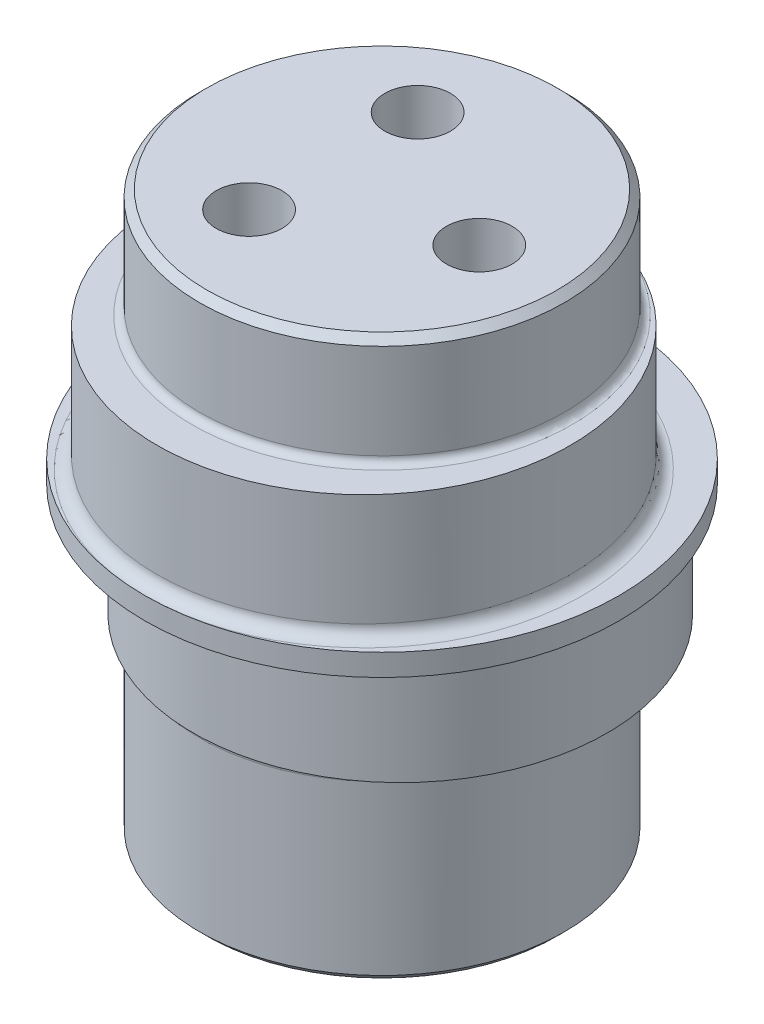
ISO-10303-21;
HEADER;
FILE_DESCRIPTION(('STEP AP214'),'2;1');
FILE_NAME('part.step','',(''),(''),'','','');
FILE_SCHEMA(('AUTOMOTIVE_DESIGN { 1 0 10303 214 1 1 1 1 }'));
ENDSEC;
DATA;
#1=APPLICATION_CONTEXT('core data for automotive mechanical design processes');
#2=APPLICATION_PROTOCOL_DEFINITION('international standard','automotive_design',2000,#1);
#3=PRODUCT_CONTEXT('',#1,'mechanical');
#4=PRODUCT('Part','Part','',(#3));
#5=PRODUCT_RELATED_PRODUCT_CATEGORY('part','',(#4));
#6=PRODUCT_DEFINITION_FORMATION('','',#4);
#7=PRODUCT_DEFINITION_CONTEXT('part definition',#1,'design');
#8=PRODUCT_DEFINITION('design','',#6,#7);
#9=PRODUCT_DEFINITION_SHAPE('','',#8);
#10=(LENGTH_UNIT() NAMED_UNIT(*) SI_UNIT(.MILLI.,.METRE.));
#11=(NAMED_UNIT(*) PLANE_ANGLE_UNIT() SI_UNIT($,.RADIAN.));
#12=(NAMED_UNIT(*) SI_UNIT($,.STERADIAN.) SOLID_ANGLE_UNIT());
#13=UNCERTAINTY_MEASURE_WITH_UNIT(LENGTH_MEASURE(1.E-05),#10,'distance_accuracy_value','');
#14=(GEOMETRIC_REPRESENTATION_CONTEXT(3) GLOBAL_UNCERTAINTY_ASSIGNED_CONTEXT((#13)) GLOBAL_UNIT_ASSIGNED_CONTEXT((#10,
#11,#12)) REPRESENTATION_CONTEXT('',''));
#15=CARTESIAN_POINT('',(0.,0.,0.));
#16=DIRECTION('',(0.,0.,1.));
#17=DIRECTION('',(1.,0.,0.));
#18=AXIS2_PLACEMENT_3D('',#15,#16,#17);
#19=CARTESIAN_POINT('',(-2.,15.5,3.46410161513775));
#20=DIRECTION('',(0.,-1.,0.));
#21=DIRECTION('',(0.,0.,-1.));
#22=AXIS2_PLACEMENT_3D('',#19,#20,#21);
#23=CYLINDRICAL_SURFACE('',#22,1.35);
#24=CARTESIAN_POINT('',(-2.,15.5,3.46410161513775));
#25=DIRECTION('',(0.,-1.,0.));
#26=DIRECTION('',(0.,0.,-1.));
#27=AXIS2_PLACEMENT_3D('',#24,#25,#26);
#28=CIRCLE('',#27,1.35);
#29=CARTESIAN_POINT('',(-2.,15.5,2.11410161513775));
#30=VERTEX_POINT('',#29);
#31=EDGE_CURVE('E251',#30,#30,#28,.T.);
#32=ORIENTED_EDGE('',*,*,#31,.F.);
#33=EDGE_LOOP('',(#32));
#34=FACE_BOUND('',#33,.T.);
#35=CARTESIAN_POINT('',(-2.,-4.5,3.46410161513775));
#36=DIRECTION('',(0.,-1.,0.));
#37=DIRECTION('',(0.,0.,-1.));
#38=AXIS2_PLACEMENT_3D('',#35,#36,#37);
#39=CIRCLE('',#38,1.35);
#40=CARTESIAN_POINT('',(-2.,-4.5,2.11410161513775));
#41=VERTEX_POINT('',#40);
#42=EDGE_CURVE('E255',#41,#41,#39,.F.);
#43=ORIENTED_EDGE('',*,*,#42,.F.);
#44=EDGE_LOOP('',(#43));
#45=FACE_BOUND('',#44,.T.);
#46=ADVANCED_FACE('F38',(#34,#45),#23,.F.);
#47=CARTESIAN_POINT('',(-2.,15.5,-3.46410161513776));
#48=DIRECTION('',(0.,-1.,0.));
#49=DIRECTION('',(0.,0.,-1.));
#50=AXIS2_PLACEMENT_3D('',#47,#48,#49);
#51=CYLINDRICAL_SURFACE('',#50,1.35);
#52=CARTESIAN_POINT('',(-2.,15.5,-3.46410161513776));
#53=DIRECTION('',(0.,-1.,0.));
#54=DIRECTION('',(0.,0.,-1.));
#55=AXIS2_PLACEMENT_3D('',#52,#53,#54);
#56=CIRCLE('',#55,1.35);
#57=CARTESIAN_POINT('',(-2.,15.5,-4.81410161513775));
#58=VERTEX_POINT('',#57);
#59=EDGE_CURVE('E254',#58,#58,#56,.T.);
#60=ORIENTED_EDGE('',*,*,#59,.F.);
#61=EDGE_LOOP('',(#60));
#62=FACE_BOUND('',#61,.T.);
#63=CARTESIAN_POINT('',(-2.,-4.5,-3.46410161513776));
#64=DIRECTION('',(0.,-1.,0.));
#65=DIRECTION('',(0.,0.,-1.));
#66=AXIS2_PLACEMENT_3D('',#63,#64,#65);
#67=CIRCLE('',#66,1.35);
#68=CARTESIAN_POINT('',(-2.,-4.5,-4.81410161513775));
#69=VERTEX_POINT('',#68);
#70=EDGE_CURVE('E309',#69,#69,#67,.F.);
#71=ORIENTED_EDGE('',*,*,#70,.F.);
#72=EDGE_LOOP('',(#71));
#73=FACE_BOUND('',#72,.T.);
#74=ADVANCED_FACE('F198',(#62,#73),#51,.F.);
#75=CARTESIAN_POINT('',(4.,15.5,0.));
#76=DIRECTION('',(0.,-1.,0.));
#77=DIRECTION('',(0.,0.,-1.));
#78=AXIS2_PLACEMENT_3D('',#75,#76,#77);
#79=CYLINDRICAL_SURFACE('',#78,1.35);
#80=CARTESIAN_POINT('',(4.,15.5,0.));
#81=DIRECTION('',(0.,-1.,0.));
#82=DIRECTION('',(0.,0.,-1.));
#83=AXIS2_PLACEMENT_3D('',#80,#81,#82);
#84=CIRCLE('',#83,1.35);
#85=CARTESIAN_POINT('',(4.,15.5,-1.35));
#86=VERTEX_POINT('',#85);
#87=EDGE_CURVE('E258',#86,#86,#84,.T.);
#88=ORIENTED_EDGE('',*,*,#87,.F.);
#89=EDGE_LOOP('',(#88));
#90=FACE_BOUND('',#89,.T.);
#91=CARTESIAN_POINT('',(4.,-4.5,0.));
#92=DIRECTION('',(0.,-1.,0.));
#93=DIRECTION('',(0.,0.,-1.));
#94=AXIS2_PLACEMENT_3D('',#91,#92,#93);
#95=CIRCLE('',#94,1.35);
#96=CARTESIAN_POINT('',(4.,-4.5,-1.35));
#97=VERTEX_POINT('',#96);
#98=EDGE_CURVE('E264',#97,#97,#95,.F.);
#99=ORIENTED_EDGE('',*,*,#98,.F.);
#100=EDGE_LOOP('',(#99));
#101=FACE_BOUND('',#100,.T.);
#102=ADVANCED_FACE('F204',(#90,#101),#79,.F.);
#103=CARTESIAN_POINT('',(0.,5.,-0.75));
#104=DIRECTION('',(0.,-1.,0.));
#105=DIRECTION('',(0.,0.,-1.));
#106=AXIS2_PLACEMENT_3D('',#103,#104,#105);
#107=CYLINDRICAL_SURFACE('',#106,8.5);
#108=CARTESIAN_POINT('',(0.,4.5,-0.75));
#109=DIRECTION('',(0.,1.,0.));
#110=DIRECTION('',(0.,0.,1.));
#111=AXIS2_PLACEMENT_3D('',#108,#109,#110);
#112=CIRCLE('',#111,8.5);
#113=CARTESIAN_POINT('',(0.,4.5,7.75));
#114=VERTEX_POINT('',#113);
#115=EDGE_CURVE('E314',#114,#114,#112,.F.);
#116=ORIENTED_EDGE('',*,*,#115,.T.);
#117=EDGE_LOOP('',(#116));
#118=FACE_BOUND('',#117,.T.);
#119=CARTESIAN_POINT('',(0.,0.,-0.75));
#120=DIRECTION('',(0.,1.,0.));
#121=DIRECTION('',(0.,0.,1.));
#122=AXIS2_PLACEMENT_3D('',#119,#120,#121);
#123=CIRCLE('',#122,8.5);
#124=CARTESIAN_POINT('',(2.92284060841881,0.,7.23166666666668));
#125=VERTEX_POINT('',#124);
#126=CARTESIAN_POINT('',(-2.92284060841881,0.,7.23166666666668));
#127=VERTEX_POINT('',#126);
#128=EDGE_CURVE('E235',#125,#127,#123,.T.);
#129=ORIENTED_EDGE('',*,*,#128,.T.);
#130=EDGE_CURVE('E91',#127,#125,#123,.T.);
#131=ORIENTED_EDGE('',*,*,#130,.T.);
#132=EDGE_LOOP('',(#129,#131));
#133=FACE_BOUND('',#132,.T.);
#134=ADVANCED_FACE('F297',(#118,#133),#107,.T.);
#135=CARTESIAN_POINT('',(0.,0.,-0.75));
#136=DIRECTION('',(0.,1.,0.));
#137=DIRECTION('',(0.,0.,1.));
#138=AXIS2_PLACEMENT_3D('',#135,#136,#137);
#139=PLANE('',#138);
#140=ORIENTED_EDGE('',*,*,#128,.F.);
#141=CARTESIAN_POINT('',(0.,0.,0.));
#142=DIRECTION('',(0.,1.,0.));
#143=DIRECTION('',(0.,0.,1.));
#144=AXIS2_PLACEMENT_3D('',#141,#142,#143);
#145=CIRCLE('',#144,7.8);
#146=EDGE_CURVE('E105',#125,#127,#145,.T.);
#147=ORIENTED_EDGE('',*,*,#146,.T.);
#148=EDGE_LOOP('',(#140,#147));
#149=FACE_BOUND('',#148,.T.);
#150=ADVANCED_FACE('F302',(#149),#139,.F.);
#151=CARTESIAN_POINT('',(0.,5.,0.75));
#152=DIRECTION('',(0.,1.,0.));
#153=DIRECTION('',(0.,0.,1.));
#154=AXIS2_PLACEMENT_3D('',#151,#152,#153);
#155=PLANE('',#154);
#156=CARTESIAN_POINT('',(0.,5.,0.));
#157=DIRECTION('',(0.,1.,0.));
#158=DIRECTION('',(0.,0.,1.));
#159=AXIS2_PLACEMENT_3D('',#156,#157,#158);
#160=CIRCLE('',#159,9.75);
#161=CARTESIAN_POINT('',(0.,5.,-9.75));
#162=VERTEX_POINT('',#161);
#163=EDGE_CURVE('E245',#162,#162,#160,.T.);
#164=ORIENTED_EDGE('',*,*,#163,.F.);
#165=CARTESIAN_POINT('',(0.,5.,-0.75));
#166=DIRECTION('',(0.,1.,0.));
#167=DIRECTION('',(0.,0.,1.));
#168=AXIS2_PLACEMENT_3D('',#165,#166,#167);
#169=CIRCLE('',#168,9.);
#170=EDGE_CURVE('E52',#162,#162,#169,.T.);
#171=ORIENTED_EDGE('',*,*,#170,.T.);
#172=EDGE_LOOP('',(#164,#171));
#173=FACE_BOUND('',#172,.T.);
#174=ADVANCED_FACE('F345',(#173),#155,.F.);
#175=CARTESIAN_POINT('',(0.,5.9,0.));
#176=DIRECTION('',(0.,-1.,0.));
#177=DIRECTION('',(0.,0.,-1.));
#178=AXIS2_PLACEMENT_3D('',#175,#176,#177);
#179=CYLINDRICAL_SURFACE('',#178,9.75);
#180=CARTESIAN_POINT('',(0.,5.9,0.));
#181=DIRECTION('',(0.,1.,0.));
#182=DIRECTION('',(0.,0.,1.));
#183=AXIS2_PLACEMENT_3D('',#180,#181,#182);
#184=CIRCLE('',#183,9.75);
#185=CARTESIAN_POINT('',(0.,5.9,9.75));
#186=VERTEX_POINT('',#185);
#187=EDGE_CURVE('E248',#186,#186,#184,.T.);
#188=ORIENTED_EDGE('',*,*,#187,.F.);
#189=EDGE_LOOP('',(#188));
#190=FACE_BOUND('',#189,.T.);
#191=ORIENTED_EDGE('',*,*,#163,.T.);
#192=EDGE_LOOP('',(#191));
#193=FACE_BOUND('',#192,.T.);
#194=ADVANCED_FACE('F349',(#190,#193),#179,.T.);
#195=CARTESIAN_POINT('',(0.,5.9,0.));
#196=DIRECTION('',(0.,1.,0.));
#197=DIRECTION('',(0.,0.,1.));
#198=AXIS2_PLACEMENT_3D('',#195,#196,#197);
#199=PLANE('',#198);
#200=ORIENTED_EDGE('',*,*,#187,.T.);
#201=CARTESIAN_POINT('',(0.,5.9,0.75));
#202=DIRECTION('',(0.,1.,0.));
#203=DIRECTION('',(0.,0.,1.));
#204=AXIS2_PLACEMENT_3D('',#201,#202,#203);
#205=CIRCLE('',#204,9.);
#206=EDGE_CURVE('E57',#186,#186,#205,.F.);
#207=ORIENTED_EDGE('',*,*,#206,.T.);
#208=EDGE_LOOP('',(#200,#207));
#209=FACE_BOUND('',#208,.T.);
#210=ADVANCED_FACE('F360',(#209),#199,.T.);
#211=CARTESIAN_POINT('',(0.,11.,0.75));
#212=DIRECTION('',(0.,1.,0.));
#213=DIRECTION('',(0.,0.,1.));
#214=AXIS2_PLACEMENT_3D('',#211,#212,#213);
#215=PLANE('',#214);
#216=CARTESIAN_POINT('',(0.,11.,0.75));
#217=DIRECTION('',(0.,1.,0.));
#218=DIRECTION('',(0.,0.,1.));
#219=AXIS2_PLACEMENT_3D('',#216,#217,#218);
#220=CIRCLE('',#219,8.5);
#221=CARTESIAN_POINT('',(-2.92284060841881,11.,-7.23166666666668));
#222=VERTEX_POINT('',#221);
#223=CARTESIAN_POINT('',(2.92284060841881,11.,-7.23166666666668));
#224=VERTEX_POINT('',#223);
#225=EDGE_CURVE('E244',#222,#224,#220,.T.);
#226=ORIENTED_EDGE('',*,*,#225,.T.);
#227=CARTESIAN_POINT('',(0.,11.,0.));
#228=DIRECTION('',(0.,1.,0.));
#229=DIRECTION('',(0.,0.,1.));
#230=AXIS2_PLACEMENT_3D('',#227,#228,#229);
#231=CIRCLE('',#230,7.8);
#232=EDGE_CURVE('E326',#224,#222,#231,.F.);
#233=ORIENTED_EDGE('',*,*,#232,.T.);
#234=EDGE_LOOP('',(#226,#233));
#235=FACE_BOUND('',#234,.T.);
#236=ADVANCED_FACE('F356',(#235),#215,.T.);
#237=CARTESIAN_POINT('',(0.,11.,0.75));
#238=DIRECTION('',(0.,-1.,0.));
#239=DIRECTION('',(0.,0.,-1.));
#240=AXIS2_PLACEMENT_3D('',#237,#238,#239);
#241=CYLINDRICAL_SURFACE('',#240,8.5);
#242=CARTESIAN_POINT('',(0.,6.4,0.75));
#243=DIRECTION('',(0.,1.,0.));
#244=DIRECTION('',(0.,0.,1.));
#245=AXIS2_PLACEMENT_3D('',#242,#243,#244);
#246=CIRCLE('',#245,8.5);
#247=CARTESIAN_POINT('',(0.,6.4,9.25));
#248=VERTEX_POINT('',#247);
#249=EDGE_CURVE('E177',#248,#248,#246,.T.);
#250=ORIENTED_EDGE('',*,*,#249,.T.);
#251=EDGE_LOOP('',(#250));
#252=FACE_BOUND('',#251,.T.);
#253=EDGE_CURVE('E241',#224,#222,#220,.T.);
#254=ORIENTED_EDGE('',*,*,#253,.F.);
#255=ORIENTED_EDGE('',*,*,#225,.F.);
#256=EDGE_LOOP('',(#254,#255));
#257=FACE_BOUND('',#256,.T.);
#258=ADVANCED_FACE('F352',(#252,#257),#241,.T.);
#259=CARTESIAN_POINT('',(0.,15.5,0.));
#260=DIRECTION('',(0.,-1.,0.));
#261=DIRECTION('',(0.,0.,-1.));
#262=AXIS2_PLACEMENT_3D('',#259,#260,#261);
#263=CYLINDRICAL_SURFACE('',#262,7.5);
#264=CARTESIAN_POINT('',(0.,15.2,0.));
#265=DIRECTION('',(0.,1.,0.));
#266=DIRECTION('',(0.,0.,1.));
#267=AXIS2_PLACEMENT_3D('',#264,#265,#266);
#268=CIRCLE('',#267,7.5);
#269=CARTESIAN_POINT('',(0.,15.2,7.5));
#270=VERTEX_POINT('',#269);
#271=EDGE_CURVE('E11',#270,#270,#268,.F.);
#272=ORIENTED_EDGE('',*,*,#271,.T.);
#273=EDGE_LOOP('',(#272));
#274=FACE_BOUND('',#273,.T.);
#275=CARTESIAN_POINT('',(0.,11.3,0.));
#276=DIRECTION('',(0.,1.,0.));
#277=DIRECTION('',(0.,0.,1.));
#278=AXIS2_PLACEMENT_3D('',#275,#276,#277);
#279=CIRCLE('',#278,7.5);
#280=CARTESIAN_POINT('',(-2.81042366194116,11.3,-6.95352564102565));
#281=VERTEX_POINT('',#280);
#282=CARTESIAN_POINT('',(2.81042366194116,11.3,-6.95352564102565));
#283=VERTEX_POINT('',#282);
#284=EDGE_CURVE('E107',#281,#283,#279,.T.);
#285=ORIENTED_EDGE('',*,*,#284,.T.);
#286=CARTESIAN_POINT('',(3.42661707646707,11.29887783112,-6.67145377045096));
#287=CARTESIAN_POINT('',(3.42559649074183,10.9717556479469,-6.67197796751421));
#288=CARTESIAN_POINT('',(3.57458371878677,11.,-6.96183189893196));
#289=CARTESIAN_POINT('',(3.24021780547267,11.299630464701,-6.76721537681055));
#290=CARTESIAN_POINT('',(3.24255553831425,10.9820218091444,-6.76616827196237));
#291=CARTESIAN_POINT('',(3.37641030183633,11.,-7.05369975053847));
#292=CARTESIAN_POINT('',(3.04979498297188,11.2999504551244,-6.85512498255487));
#293=CARTESIAN_POINT('',(3.05191157084359,10.9907873242966,-6.85430330494979));
#294=CARTESIAN_POINT('',(3.17498254013272,11.,-7.13777450821522));
#295=CARTESIAN_POINT('',(2.66227483668071,11.3000398221389,-7.01470769069346));
#296=CARTESIAN_POINT('',(2.6648028741463,11.0055976466942,-7.013617905485));
#297=CARTESIAN_POINT('',(2.76676390811614,11.,-7.29005174489685));
#298=CARTESIAN_POINT('',(2.46517788093677,11.2998092290436,-7.08638168673307));
#299=CARTESIAN_POINT('',(2.46734981088588,11.0117510472977,-7.08566956098198));
#300=CARTESIAN_POINT('',(2.55997333368333,11.,-7.35825509750606));
#301=CARTESIAN_POINT('',(2.06595778532719,11.2991126325111,-7.21287737323461));
#302=CARTESIAN_POINT('',(2.0682791893251,11.0220036222834,-7.21216528851013));
#303=CARTESIAN_POINT('',(2.14246271237897,11.,-7.47842434943333));
#304=CARTESIAN_POINT('',(1.86384254114973,11.2986469790473,-7.26772392289646));
#305=CARTESIAN_POINT('',(1.86571079864528,11.0261690197102,-7.26727678678291));
#306=CARTESIAN_POINT('',(1.93174895449553,11.,-7.530414202855));
#307=CARTESIAN_POINT('',(1.45578931745062,11.2977081427026,-7.36033282851974));
#308=CARTESIAN_POINT('',(1.45764317994122,11.0329042612406,-7.35993494524017));
#309=CARTESIAN_POINT('',(1.5073095395259,11.,-7.61809554048412));
#310=CARTESIAN_POINT('',(1.24985136459923,11.2972349598743,-7.39809530362666));
#311=CARTESIAN_POINT('',(1.25118354438375,11.0355106286144,-7.39792891807439));
#312=CARTESIAN_POINT('',(1.29358390345547,11.,-7.65378713835672));
#313=CARTESIAN_POINT('',(0.625315112082931,11.2960774558286,-7.48573627591765));
#314=CARTESIAN_POINT('',(0.628862132790521,11.0413988305498,-7.48519754716966));
#315=CARTESIAN_POINT('',(0.646353719918522,11.,-7.7365820152759));
#316=CARTESIAN_POINT('',(0.202694055332462,11.2956650911108,-7.50911400888112));
#317=CARTESIAN_POINT('',(0.202110014819041,11.0428416486147,-7.50910449436265));
#318=CARTESIAN_POINT('',(0.209609964426694,11.,-7.75859738309841));
#319=CARTESIAN_POINT('',(-0.640468697414072,11.29604112319,-7.48449640898827));
#320=CARTESIAN_POINT('',(-0.641457731944169,11.041262338408,-7.48445997042964));
#321=CARTESIAN_POINT('',(-0.662248533128678,11.,-7.73537561694435));
#322=CARTESIAN_POINT('',(-1.06101036027408,11.2968295390607,-7.43649994240693));
#323=CARTESIAN_POINT('',(-1.06610026288517,11.0382109693301,-7.43544314782227));
#324=CARTESIAN_POINT('',(-1.09736324920611,11.,-7.69013741469584));
#325=CARTESIAN_POINT('',(-1.68079470704124,11.2982160543476,-7.31228278359564));
#326=CARTESIAN_POINT('',(-1.68254539730568,11.0294524261598,-7.31195052439859));
#327=CARTESIAN_POINT('',(-1.74119902704398,11.,-7.57261627781647));
#328=CARTESIAN_POINT('',(-1.8855719254538,11.2987122694487,-7.26216549234535));
#329=CARTESIAN_POINT('',(-1.88780679683193,11.0257675257551,-7.26153925086682));
#330=CARTESIAN_POINT('',(-1.95435967110387,11.,-7.52515783588596));
#331=CARTESIAN_POINT('',(-2.29023780254366,11.299535690764,-7.14486796754013));
#332=CARTESIAN_POINT('',(-2.2923666506819,11.0165883024139,-7.14422898580564));
#333=CARTESIAN_POINT('',(-2.3768089348923,11.,-7.41384999625708));
#334=CARTESIAN_POINT('',(-2.49012639891203,11.2998628948251,-7.07768751662733));
#335=CARTESIAN_POINT('',(-2.49264966433367,11.0110387010834,-7.07673594835737));
#336=CARTESIAN_POINT('',(-2.58609750526026,11.,-7.3500003897609));
#337=CARTESIAN_POINT('',(-2.88382677663446,11.3000707626314,-6.92661994082238));
#338=CARTESIAN_POINT('',(-2.88603555864986,10.9975947543066,-6.92575535691926));
#339=CARTESIAN_POINT('',(-2.99988203179683,11.,-7.20605244828745));
#340=CARTESIAN_POINT('',(-3.07762874901683,11.2999507394922,-6.84270730462392));
#341=CARTESIAN_POINT('',(-3.08011397680816,10.989602536775,-6.84142623057053));
#342=CARTESIAN_POINT('',(-3.20437012998442,11.,-7.1259292977764));
#343=CARTESIAN_POINT('',(-3.45748702988333,11.2988918340629,-6.65885785520499));
#344=CARTESIAN_POINT('',(-3.45931853401965,10.970502836969,-6.65805208597309));
#345=CARTESIAN_POINT('',(-3.60707540950928,11.,-6.94982781599957));
#346=CARTESIAN_POINT('',(-3.64354291512745,11.2979529070899,-6.55892016783215));
#347=CARTESIAN_POINT('',(-3.64547490455649,10.9592326556978,-6.55791710428598));
#348=CARTESIAN_POINT('',(-3.80529224804827,11.,-6.85384861979187));
#349=CARTESIAN_POINT('',(-3.82504156957382,11.2964191116532,-6.4512833600015));
#350=CARTESIAN_POINT('',(-3.82291581516437,10.9460882691479,-6.45254374472328));
#351=CARTESIAN_POINT('',(-3.99978973396581,11.,-6.75011213809912));
#352=(BOUNDED_SURFACE() B_SPLINE_SURFACE(3,2,((#286,#287,#288),(#289,#290,#291),(#292,#293,
#294),(#295,#296,#297),(#298,#299,#300),(#301,#302,#303),(#304,#305,#306),(#307,#308,#309),
(#310,#311,#312),(#313,#314,#315),(#316,#317,#318),(#319,#320,#321),(#322,#323,#324),(#325,#326,
#327),(#328,#329,#330),(#331,#332,#333),(#334,#335,#336),(#337,#338,#339),(#340,#341,#342),
(#343,#344,#345),(#346,#347,#348),(#349,#350,#351)),.UNSPECIFIED.,.F.,.F.,
.F.) B_SPLINE_SURFACE_WITH_KNOTS((4,2,2,2,2,2,2,2,2,2,4),(3,3),(0.,0.653617396953482,
1.30719880855379,1.95980998235227,2.6124166047264,3.92635300690346,5.2403102801866,
5.89742387974215,6.55454585031343,7.21267749291435,7.87084504823465),(0.,1.),
.UNSPECIFIED.) GEOMETRIC_REPRESENTATION_ITEM() RATIONAL_B_SPLINE_SURFACE(((1.,0.675891299046215,
1.),(1.,0.686731618899479,1.),(1.,0.696438019455433,1.),(1.,0.713746639189221,1.),(1.,
0.721348974184779,1.),(1.,0.734604431373084,1.),(1.,0.740260430407452,1.),(1.,0.74973074287353,
1.),(1.,0.753545069149202,1.),(1.,0.762368210079629,1.),(1.,0.76467050219067,1.),(1.,
0.762218224387509,1.),(1.,0.757463542378627,1.),(1.,0.744827948669002,1.),(1.,0.739698012879972,
1.),(1.,0.727504791028883,1.),(1.,0.720441480338573,1.),(1.,0.704243151974438,1.),(1.,
0.695104967785265,1.),(1.,0.674539181917495,1.),(1.,0.663111455337898,1.),(1.,0.650427531767148,1.))) REPRESENTATION_ITEM('') SURFACE());
#353=CARTESIAN_POINT('',(3.42661707646707,11.29887783112,-6.67145377045096));
#354=CARTESIAN_POINT('',(3.24021780547267,11.299630464701,-6.76721537681056));
#355=CARTESIAN_POINT('',(3.04979498297188,11.2999504551244,-6.85512498255487));
#356=CARTESIAN_POINT('',(2.66227483668071,11.3000398221389,-7.01470769069346));
#357=CARTESIAN_POINT('',(2.46517788093677,11.2998092290436,-7.08638168673307));
#358=CARTESIAN_POINT('',(2.06595778532719,11.2991126325111,-7.21287737323461));
#359=CARTESIAN_POINT('',(1.86384254114973,11.2986469790473,-7.26772392289646));
#360=CARTESIAN_POINT('',(1.45578931745062,11.2977081427026,-7.36033282851974));
#361=CARTESIAN_POINT('',(1.24985136459923,11.2972349598743,-7.39809530362666));
#362=CARTESIAN_POINT('',(0.625315112082931,11.2960774558286,-7.48573627591765));
#363=CARTESIAN_POINT('',(0.202694055332462,11.2956650911108,-7.50911400888112));
#364=CARTESIAN_POINT('',(-0.640468697414071,11.29604112319,-7.48449640898827));
#365=CARTESIAN_POINT('',(-1.06101036027408,11.2968295390607,-7.43649994240693));
#366=CARTESIAN_POINT('',(-1.68079470704124,11.2982160543476,-7.31228278359564));
#367=CARTESIAN_POINT('',(-1.8855719254538,11.2987122694487,-7.26216549234535));
#368=CARTESIAN_POINT('',(-2.29023780254366,11.299535690764,-7.14486796754013));
#369=CARTESIAN_POINT('',(-2.49012639891203,11.2998628948251,-7.07768751662733));
#370=CARTESIAN_POINT('',(-2.88382677663446,11.3000707626314,-6.92661994082238));
#371=CARTESIAN_POINT('',(-3.07762874901683,11.2999507394922,-6.84270730462392));
#372=CARTESIAN_POINT('',(-3.45748702988333,11.2988918340629,-6.65885785520499));
#373=CARTESIAN_POINT('',(-3.64354291512745,11.2979529070899,-6.55892016783215));
#374=CARTESIAN_POINT('',(-3.82504156957382,11.2964191116532,-6.4512833600015));
#375=B_SPLINE_CURVE_WITH_KNOTS('',3,(#353,#354,#355,#356,#357,#358,#359,#360,#361,#362,#363,
#364,#365,#366,#367,#368,#369,#370,#371,#372,#373,#374),.UNSPECIFIED.,.F.,.F.,(4,2,2,2,2,2,2,2,
2,2,4),(0.,0.653617396953482,1.30719880855379,1.95980998235227,2.6124166047264,3.92635300690346,
5.2403102801866,5.89742387974215,6.55454585031343,7.21267749291435,7.87084504823464),.UNSPECIFIED.);
#376=EDGE_CURVE('E329',#283,#281,#375,.T.);
#377=ORIENTED_EDGE('',*,*,#376,.T.);
#378=EDGE_LOOP('',(#285,#377));
#379=FACE_BOUND('',#378,.T.);
#380=ADVANCED_FACE('F166',(#274,#379),#263,.T.);
#381=CARTESIAN_POINT('',(0.,15.5,0.));
#382=DIRECTION('',(0.,1.,0.));
#383=DIRECTION('',(0.,0.,1.));
#384=AXIS2_PLACEMENT_3D('',#381,#382,#383);
#385=PLANE('',#384);
#386=CARTESIAN_POINT('',(0.,15.5,0.));
#387=DIRECTION('',(0.,1.,0.));
#388=DIRECTION('',(0.,0.,1.));
#389=AXIS2_PLACEMENT_3D('',#386,#387,#388);
#390=CIRCLE('',#389,7.2);
#391=CARTESIAN_POINT('',(0.,15.5,7.2));
#392=VERTEX_POINT('',#391);
#393=EDGE_CURVE('E47',#392,#392,#390,.T.);
#394=ORIENTED_EDGE('',*,*,#393,.T.);
#395=EDGE_LOOP('',(#394));
#396=FACE_BOUND('',#395,.T.);
#397=ORIENTED_EDGE('',*,*,#87,.T.);
#398=EDGE_LOOP('',(#397));
#399=FACE_BOUND('',#398,.T.);
#400=ORIENTED_EDGE('',*,*,#59,.T.);
#401=EDGE_LOOP('',(#400));
#402=FACE_BOUND('',#401,.T.);
#403=ORIENTED_EDGE('',*,*,#31,.T.);
#404=EDGE_LOOP('',(#403));
#405=FACE_BOUND('',#404,.T.);
#406=ADVANCED_FACE('F218',(#396,#399,#402,#405),#385,.T.);
#407=CARTESIAN_POINT('',(0.,-7.5,0.));
#408=DIRECTION('',(0.,1.,0.));
#409=DIRECTION('',(0.,0.,1.));
#410=AXIS2_PLACEMENT_3D('',#407,#408,#409);
#411=CYLINDRICAL_SURFACE('',#410,7.5);
#412=CARTESIAN_POINT('',(0.,-0.3,0.));
#413=DIRECTION('',(0.,1.,0.));
#414=DIRECTION('',(0.,0.,1.));
#415=AXIS2_PLACEMENT_3D('',#412,#413,#414);
#416=CIRCLE('',#415,7.5);
#417=CARTESIAN_POINT('',(-2.81042366194116,-0.3,6.95352564102565));
#418=VERTEX_POINT('',#417);
#419=CARTESIAN_POINT('',(2.81042366194116,-0.3,6.95352564102565));
#420=VERTEX_POINT('',#419);
#421=EDGE_CURVE('E98',#418,#420,#416,.F.);
#422=ORIENTED_EDGE('',*,*,#421,.T.);
#423=CARTESIAN_POINT('',(3.42661707646374,-0.298877831120029,6.67145377045266));
#424=CARTESIAN_POINT('',(3.42559650132304,0.0282443525781013,6.67197796207945));
#425=CARTESIAN_POINT('',(3.57458372865642,0.,6.96183189435719));
#426=CARTESIAN_POINT('',(3.24021780546343,-0.299630464701073,6.76721537681519));
#427=CARTESIAN_POINT('',(3.24255554199849,0.0179781910377985,6.76616827007305));
#428=CARTESIAN_POINT('',(3.37641030537706,0.,7.05369974890023));
#429=CARTESIAN_POINT('',(3.04979498295646,-0.299950455124396,6.85512498256193));
#430=CARTESIAN_POINT('',(3.05191157179082,0.00921267575027254,6.85430330446322));
#431=CARTESIAN_POINT('',(3.17498254106892,0.,7.137774507782));
#432=CARTESIAN_POINT('',(2.66227483665345,-0.300039822138912,7.01470769070397));
#433=CARTESIAN_POINT('',(2.66480287320837,-0.00559764674050964,7.0136179059654));
#434=CARTESIAN_POINT('',(2.76676390713504,0.,7.29005174534682));
#435=CARTESIAN_POINT('',(2.46517788090386,-0.299809229043558,7.08638168674468));
#436=CARTESIAN_POINT('',(2.46734981061186,-0.0117510473105716,7.08566956111609));
#437=CARTESIAN_POINT('',(2.5599733333893,0.,7.35825509763434));
#438=CARTESIAN_POINT('',(2.06595778529403,-0.299112632510991,7.21287737324393));
#439=CARTESIAN_POINT('',(2.06827918952079,-0.0220036222727043,7.21216528840177));
#440=CARTESIAN_POINT('',(2.14246271260355,0.,7.4784243493251));
#441=CARTESIAN_POINT('',(1.86384254112226,-0.298646979047237,7.26772392290333));
#442=CARTESIAN_POINT('',(1.86571079869128,-0.0261690197078396,7.2672767867609));
#443=CARTESIAN_POINT('',(1.93174895455318,0.,7.53041420283225));
#444=CARTESIAN_POINT('',(1.45578931743482,-0.297708142702611,7.36033282852269));
#445=CARTESIAN_POINT('',(1.45764317985449,-0.0329042612436405,7.35993494527129));
#446=CARTESIAN_POINT('',(1.50730953942312,0.,7.61809554051619));
#447=CARTESIAN_POINT('',(1.2498513645894,-0.297234959874275,7.39809530362815));
#448=CARTESIAN_POINT('',(1.25118354430418,-0.0355106286147467,7.39792891807576));
#449=CARTESIAN_POINT('',(1.29358390335921,0.,7.65378713835813));
#450=CARTESIAN_POINT('',(0.625315112085093,-0.29607745582865,7.48573627591713));
#451=CARTESIAN_POINT('',(0.628862132931122,-0.0413988305493628,7.48519754716942));
#452=CARTESIAN_POINT('',(0.646353720094168,0.,7.73658201527537));
#453=CARTESIAN_POINT('',(0.202694055340748,-0.295665091110758,7.50911400888056));
#454=CARTESIAN_POINT('',(0.202110015400476,-0.0428416486231407,7.5091044944728));
#455=CARTESIAN_POINT('',(0.209609965129826,0.,7.75859738321638));
#456=CARTESIAN_POINT('',(-0.640468697405836,-0.296041123190031,7.48449640898931));
#457=CARTESIAN_POINT('',(-0.641457732524765,-0.0412623383995078,7.48445997031921));
#458=CARTESIAN_POINT('',(-0.662248533814707,0.,7.73537561682683));
#459=CARTESIAN_POINT('',(-1.06101036027196,-0.296829539060724,7.43649994240756));
#460=CARTESIAN_POINT('',(-1.06610026514291,-0.0382109692950351,7.43544314737119));
#461=CARTESIAN_POINT('',(-1.09736325180877,0.,7.69013741422241));
#462=CARTESIAN_POINT('',(-1.68079470704497,-0.298216054347605,7.31228278359479));
#463=CARTESIAN_POINT('',(-1.68254539860962,-0.0294524261394437,7.31195052413641));
#464=CARTESIAN_POINT('',(-1.7411990284944,0.,7.57261627755081));
#465=CARTESIAN_POINT('',(-1.8855719254575,-0.298712269448737,7.26216549234439));
#466=CARTESIAN_POINT('',(-1.88780679719026,-0.0257675257494469,7.26153925079449));
#467=CARTESIAN_POINT('',(-1.95435967149721,0.,7.52515783581374));
#468=CARTESIAN_POINT('',(-2.2902378025473,-0.299535690764013,7.14486796753896));
#469=CARTESIAN_POINT('',(-2.29236665032073,-0.0165883024195508,7.14422898587827));
#470=CARTESIAN_POINT('',(-2.37680893450664,0.,7.41384999632728));
#471=CARTESIAN_POINT('',(-2.49012639891564,-0.29986289482506,7.07768751662607));
#472=CARTESIAN_POINT('',(-2.49264966423136,-0.0110387010849246,7.0767359483776));
#473=CARTESIAN_POINT('',(-2.5860975051527,0.,7.35000038978007));
#474=CARTESIAN_POINT('',(-2.88382677663798,-0.300070762631393,6.92661994082091));
#475=CARTESIAN_POINT('',(-2.88603555876316,0.00240524569528322,6.92575535689528));
#476=CARTESIAN_POINT('',(-2.99988203191209,0.,7.20605244826562));
#477=CARTESIAN_POINT('',(-3.07762874902031,-0.299950739492203,6.84270730462236));
#478=CARTESIAN_POINT('',(-3.08011397686756,0.0103974632260686,6.84142623055742));
#479=CARTESIAN_POINT('',(-3.20437013004388,0.,7.12592929776468));
#480=CARTESIAN_POINT('',(-3.45748702988672,-0.298891834062873,6.65885785520323));
#481=CARTESIAN_POINT('',(-3.45931853396481,0.0294971630302801,6.65805208598352));
#482=CARTESIAN_POINT('',(-3.60707540945712,0.,6.94982781600809));
#483=CARTESIAN_POINT('',(-3.64354291513079,-0.297952907089844,6.5589201678303));
#484=CARTESIAN_POINT('',(-3.64547490444072,0.040767344300468,6.55791710430926));
#485=CARTESIAN_POINT('',(-3.80529224794027,0.,6.85384861981052));
#486=CARTESIAN_POINT('',(-3.8250415695771,-0.296419111653152,6.45128335999955));
#487=CARTESIAN_POINT('',(-3.82291581516755,0.053911730852348,6.4525437447214));
#488=CARTESIAN_POINT('',(-3.99978973396925,0.,6.75011213809728));
#489=(BOUNDED_SURFACE() B_SPLINE_SURFACE(3,2,((#423,#424,#425),(#426,#427,#428),(#429,#430,
#431),(#432,#433,#434),(#435,#436,#437),(#438,#439,#440),(#441,#442,#443),(#444,#445,#446),
(#447,#448,#449),(#450,#451,#452),(#453,#454,#455),(#456,#457,#458),(#459,#460,#461),(#462,#463,
#464),(#465,#466,#467),(#468,#469,#470),(#471,#472,#473),(#474,#475,#476),(#477,#478,#479),
(#480,#481,#482),(#483,#484,#485),(#486,#487,#488)),.UNSPECIFIED.,.F.,.F.,
.F.) B_SPLINE_SURFACE_WITH_KNOTS((4,2,2,2,2,2,2,2,2,2,4),(3,3),(0.,0.653617396974076,
1.30719880859204,1.95980998237145,2.61241660472648,3.92635300688478,5.24031028018669,
5.89742387974225,6.55454585031352,7.21267749291444,7.87084504823474),(0.,1.),
.UNSPECIFIED.) GEOMETRIC_REPRESENTATION_ITEM() RATIONAL_B_SPLINE_SURFACE(((1.,0.675891298503867,
1.),(1.,0.686731618705244,1.),(1.,0.696438019404043,1.),(1.,0.713746639242507,1.),(1.,
0.721348974199916,1.),(1.,0.73460443136016,1.),(1.,0.740260430404654,1.),(1.,0.749730742877335,
1.),(1.,0.753545069149484,1.),(1.,0.76236821007931,1.),(1.,0.764670502203222,1.),(1.,
0.762218224375007,1.),(1.,0.757463542327997,1.),(1.,0.744827948640576,1.),(1.,0.739698012872243,
1.),(1.,0.72750479103639,1.),(1.,0.72044148034062,1.),(1.,0.704243151972093,1.),(1.,
0.695104967783999,1.),(1.,0.674539181918387,1.),(1.,0.66311145533987,1.),(1.,0.650427531766924,1.))) REPRESENTATION_ITEM('') SURFACE());
#490=CARTESIAN_POINT('',(3.42661707646374,-0.298877831120029,6.67145377045266));
#491=CARTESIAN_POINT('',(3.24021780546343,-0.299630464701073,6.76721537681519));
#492=CARTESIAN_POINT('',(3.04979498295646,-0.299950455124396,6.85512498256193));
#493=CARTESIAN_POINT('',(2.66227483665345,-0.300039822138912,7.01470769070397));
#494=CARTESIAN_POINT('',(2.46517788090386,-0.299809229043558,7.08638168674468));
#495=CARTESIAN_POINT('',(2.06595778529403,-0.299112632510991,7.21287737324393));
#496=CARTESIAN_POINT('',(1.86384254112226,-0.298646979047237,7.26772392290333));
#497=CARTESIAN_POINT('',(1.45578931743482,-0.297708142702611,7.36033282852269));
#498=CARTESIAN_POINT('',(1.2498513645894,-0.297234959874275,7.39809530362815));
#499=CARTESIAN_POINT('',(0.625315112085093,-0.29607745582865,7.48573627591713));
#500=CARTESIAN_POINT('',(0.202694055340748,-0.295665091110758,7.50911400888056));
#501=CARTESIAN_POINT('',(-0.640468697405836,-0.296041123190031,7.48449640898931));
#502=CARTESIAN_POINT('',(-1.06101036027196,-0.296829539060724,7.43649994240757));
#503=CARTESIAN_POINT('',(-1.68079470704497,-0.298216054347605,7.31228278359479));
#504=CARTESIAN_POINT('',(-1.8855719254575,-0.298712269448737,7.26216549234439));
#505=CARTESIAN_POINT('',(-2.2902378025473,-0.299535690764013,7.14486796753896));
#506=CARTESIAN_POINT('',(-2.49012639891564,-0.29986289482506,7.07768751662607));
#507=CARTESIAN_POINT('',(-2.88382677663798,-0.300070762631393,6.92661994082091));
#508=CARTESIAN_POINT('',(-3.07762874902031,-0.299950739492203,6.84270730462236));
#509=CARTESIAN_POINT('',(-3.45748702988672,-0.298891834062873,6.65885785520323));
#510=CARTESIAN_POINT('',(-3.64354291513079,-0.297952907089844,6.5589201678303));
#511=CARTESIAN_POINT('',(-3.8250415695771,-0.296419111653152,6.45128335999955));
#512=B_SPLINE_CURVE_WITH_KNOTS('',3,(#490,#491,#492,#493,#494,#495,#496,#497,#498,#499,#500,
#501,#502,#503,#504,#505,#506,#507,#508,#509,#510,#511),.UNSPECIFIED.,.F.,.F.,(4,2,2,2,2,2,2,2,
2,2,4),(0.,0.653617396974076,1.30719880859204,1.95980998237145,2.61241660472648,
3.92635300688478,5.24031028018669,5.89742387974225,6.55454585031352,7.21267749291444,
7.87084504823474),.UNSPECIFIED.);
#513=EDGE_CURVE('E89',#420,#418,#512,.T.);
#514=ORIENTED_EDGE('',*,*,#513,.T.);
#515=EDGE_LOOP('',(#422,#514));
#516=FACE_BOUND('',#515,.T.);
#517=CARTESIAN_POINT('',(0.,-7.2,0.));
#518=DIRECTION('',(0.,-1.,0.));
#519=DIRECTION('',(0.,0.,-1.));
#520=AXIS2_PLACEMENT_3D('',#517,#518,#519);
#521=CIRCLE('',#520,7.5);
#522=CARTESIAN_POINT('',(0.,-7.2,-7.5));
#523=VERTEX_POINT('',#522);
#524=EDGE_CURVE('E101',#523,#523,#521,.F.);
#525=ORIENTED_EDGE('',*,*,#524,.T.);
#526=EDGE_LOOP('',(#525));
#527=FACE_BOUND('',#526,.T.);
#528=ADVANCED_FACE('F103',(#516,#527),#411,.T.);
#529=CARTESIAN_POINT('',(0.,-7.5,0.));
#530=DIRECTION('',(0.,-1.,0.));
#531=DIRECTION('',(0.,0.,-1.));
#532=AXIS2_PLACEMENT_3D('',#529,#530,#531);
#533=PLANE('',#532);
#534=CARTESIAN_POINT('',(-2.,-7.5,-3.46410161513776));
#535=DIRECTION('',(0.,-1.,0.));
#536=DIRECTION('',(0.,0.,-1.));
#537=AXIS2_PLACEMENT_3D('',#534,#535,#536);
#538=CIRCLE('',#537,2.8);
#539=CARTESIAN_POINT('',(-2.,-7.5,-6.26410161513776));
#540=VERTEX_POINT('',#539);
#541=EDGE_CURVE('E222',#540,#540,#538,.T.);
#542=ORIENTED_EDGE('',*,*,#541,.F.);
#543=EDGE_LOOP('',(#542));
#544=FACE_BOUND('',#543,.T.);
#545=CARTESIAN_POINT('',(4.,-7.5,0.));
#546=DIRECTION('',(0.,-1.,0.));
#547=DIRECTION('',(0.,0.,-1.));
#548=AXIS2_PLACEMENT_3D('',#545,#546,#547);
#549=CIRCLE('',#548,2.8);
#550=CARTESIAN_POINT('',(4.,-7.5,-2.8));
#551=VERTEX_POINT('',#550);
#552=EDGE_CURVE('E226',#551,#551,#549,.T.);
#553=ORIENTED_EDGE('',*,*,#552,.F.);
#554=EDGE_LOOP('',(#553));
#555=FACE_BOUND('',#554,.T.);
#556=CARTESIAN_POINT('',(-2.,-7.5,3.46410161513775));
#557=DIRECTION('',(0.,-1.,0.));
#558=DIRECTION('',(0.,0.,-1.));
#559=AXIS2_PLACEMENT_3D('',#556,#557,#558);
#560=CIRCLE('',#559,2.8);
#561=CARTESIAN_POINT('',(-2.,-7.5,0.664101615137754));
#562=VERTEX_POINT('',#561);
#563=EDGE_CURVE('E230',#562,#562,#560,.T.);
#564=ORIENTED_EDGE('',*,*,#563,.F.);
#565=EDGE_LOOP('',(#564));
#566=FACE_BOUND('',#565,.T.);
#567=CARTESIAN_POINT('',(0.,-7.5,0.));
#568=DIRECTION('',(0.,-1.,0.));
#569=DIRECTION('',(0.,0.,-1.));
#570=AXIS2_PLACEMENT_3D('',#567,#568,#569);
#571=CIRCLE('',#570,7.2);
#572=CARTESIAN_POINT('',(0.,-7.5,-7.2));
#573=VERTEX_POINT('',#572);
#574=EDGE_CURVE('E233',#573,#573,#571,.T.);
#575=ORIENTED_EDGE('',*,*,#574,.T.);
#576=EDGE_LOOP('',(#575));
#577=FACE_BOUND('',#576,.T.);
#578=ADVANCED_FACE('F210',(#544,#555,#566,#577),#533,.T.);
#579=CARTESIAN_POINT('',(0.,-7.5,0.));
#580=DIRECTION('',(0.,1.,0.));
#581=DIRECTION('',(0.,0.,1.));
#582=AXIS2_PLACEMENT_3D('',#579,#580,#581);
#583=CONICAL_SURFACE('',#582,7.2,0.785398163397444);
#584=ORIENTED_EDGE('',*,*,#524,.F.);
#585=EDGE_LOOP('',(#584));
#586=FACE_BOUND('',#585,.T.);
#587=ORIENTED_EDGE('',*,*,#574,.F.);
#588=EDGE_LOOP('',(#587));
#589=FACE_BOUND('',#588,.T.);
#590=ADVANCED_FACE('F125',(#586,#589),#583,.T.);
#591=CARTESIAN_POINT('',(0.,-0.3,0.));
#592=DIRECTION('',(0.,1.,0.));
#593=DIRECTION('',(0.,0.,1.));
#594=AXIS2_PLACEMENT_3D('',#591,#592,#593);
#595=TOROIDAL_SURFACE('',#594,7.8,0.3);
#596=CARTESIAN_POINT('',(-2.92284060841881,-0.3,7.23166666666668));
#597=DIRECTION('',(-0.927136752136754,0.,-0.374723154925489));
#598=DIRECTION('',(-0.374723154925489,0.,0.927136752136754));
#599=AXIS2_PLACEMENT_3D('',#596,#597,#598);
#600=CIRCLE('',#599,0.3);
#601=EDGE_CURVE('E85',#127,#418,#600,.T.);
#602=ORIENTED_EDGE('',*,*,#601,.F.);
#603=ORIENTED_EDGE('',*,*,#146,.F.);
#604=CARTESIAN_POINT('',(2.92284060841881,-0.3,7.23166666666668));
#605=DIRECTION('',(0.927136752136754,0.,-0.374723154925489));
#606=DIRECTION('',(-0.374723154925489,0.,-0.927136752136754));
#607=AXIS2_PLACEMENT_3D('',#604,#605,#606);
#608=CIRCLE('',#607,0.3);
#609=EDGE_CURVE('E94',#420,#125,#608,.T.);
#610=ORIENTED_EDGE('',*,*,#609,.F.);
#611=ORIENTED_EDGE('',*,*,#421,.F.);
#612=EDGE_LOOP('',(#602,#603,#610,#611));
#613=FACE_BOUND('',#612,.T.);
#614=ADVANCED_FACE('F99',(#613),#595,.F.);
#615=ORIENTED_EDGE('',*,*,#609,.T.);
#616=ORIENTED_EDGE('',*,*,#130,.F.);
#617=ORIENTED_EDGE('',*,*,#601,.T.);
#618=ORIENTED_EDGE('',*,*,#513,.F.);
#619=EDGE_LOOP('',(#615,#616,#617,#618));
#620=FACE_BOUND('',#619,.T.);
#621=ADVANCED_FACE('F87',(#620),#489,.F.);
#622=CARTESIAN_POINT('',(0.,11.3,0.));
#623=DIRECTION('',(0.,1.,0.));
#624=DIRECTION('',(0.,0.,1.));
#625=AXIS2_PLACEMENT_3D('',#622,#623,#624);
#626=TOROIDAL_SURFACE('',#625,7.8,0.3);
#627=CARTESIAN_POINT('',(-2.92284060841881,11.3,-7.23166666666668));
#628=DIRECTION('',(-0.927136752136754,0.,0.374723154925489));
#629=DIRECTION('',(0.374723154925489,0.,0.927136752136754));
#630=AXIS2_PLACEMENT_3D('',#627,#628,#629);
#631=CIRCLE('',#630,0.3);
#632=EDGE_CURVE('E147',#222,#281,#631,.T.);
#633=ORIENTED_EDGE('',*,*,#632,.F.);
#634=ORIENTED_EDGE('',*,*,#232,.F.);
#635=CARTESIAN_POINT('',(2.92284060841881,11.3,-7.23166666666668));
#636=DIRECTION('',(0.927136752136754,0.,0.374723154925489));
#637=DIRECTION('',(0.374723154925489,0.,-0.927136752136754));
#638=AXIS2_PLACEMENT_3D('',#635,#636,#637);
#639=CIRCLE('',#638,0.3);
#640=EDGE_CURVE('E95',#283,#224,#639,.T.);
#641=ORIENTED_EDGE('',*,*,#640,.F.);
#642=ORIENTED_EDGE('',*,*,#284,.F.);
#643=EDGE_LOOP('',(#633,#634,#641,#642));
#644=FACE_BOUND('',#643,.T.);
#645=ADVANCED_FACE('F133',(#644),#626,.F.);
#646=ORIENTED_EDGE('',*,*,#640,.T.);
#647=ORIENTED_EDGE('',*,*,#253,.T.);
#648=ORIENTED_EDGE('',*,*,#632,.T.);
#649=ORIENTED_EDGE('',*,*,#376,.F.);
#650=EDGE_LOOP('',(#646,#647,#648,#649));
#651=FACE_BOUND('',#650,.T.);
#652=ADVANCED_FACE('F153',(#651),#352,.F.);
#653=CARTESIAN_POINT('',(0.,6.4,0.75));
#654=DIRECTION('',(0.,1.,0.));
#655=DIRECTION('',(0.,0.,1.));
#656=AXIS2_PLACEMENT_3D('',#653,#654,#655);
#657=TOROIDAL_SURFACE('',#656,9.,0.5);
#658=ORIENTED_EDGE('',*,*,#206,.F.);
#659=EDGE_LOOP('',(#658));
#660=FACE_BOUND('',#659,.T.);
#661=ORIENTED_EDGE('',*,*,#249,.F.);
#662=EDGE_LOOP('',(#661));
#663=FACE_BOUND('',#662,.T.);
#664=ADVANCED_FACE('F159',(#660,#663),#657,.F.);
#665=CARTESIAN_POINT('',(0.,4.5,-0.75));
#666=DIRECTION('',(0.,1.,0.));
#667=DIRECTION('',(0.,0.,1.));
#668=AXIS2_PLACEMENT_3D('',#665,#666,#667);
#669=TOROIDAL_SURFACE('',#668,9.,0.5);
#670=ORIENTED_EDGE('',*,*,#115,.F.);
#671=EDGE_LOOP('',(#670));
#672=FACE_BOUND('',#671,.T.);
#673=ORIENTED_EDGE('',*,*,#170,.F.);
#674=EDGE_LOOP('',(#673));
#675=FACE_BOUND('',#674,.T.);
#676=ADVANCED_FACE('F186',(#672,#675),#669,.F.);
#677=CARTESIAN_POINT('',(4.,-4.5,0.));
#678=DIRECTION('',(0.,-1.,0.));
#679=DIRECTION('',(0.,0.,-1.));
#680=AXIS2_PLACEMENT_3D('',#677,#678,#679);
#681=PLANE('',#680);
#682=CARTESIAN_POINT('',(4.,-4.5,0.));
#683=DIRECTION('',(0.,-1.,0.));
#684=DIRECTION('',(0.,0.,-1.));
#685=AXIS2_PLACEMENT_3D('',#682,#683,#684);
#686=CIRCLE('',#685,2.72144223529244);
#687=CARTESIAN_POINT('',(4.,-4.5,-2.72144223529244));
#688=VERTEX_POINT('',#687);
#689=EDGE_CURVE('E266',#688,#688,#686,.T.);
#690=ORIENTED_EDGE('',*,*,#689,.T.);
#691=EDGE_LOOP('',(#690));
#692=FACE_BOUND('',#691,.T.);
#693=ORIENTED_EDGE('',*,*,#98,.T.);
#694=EDGE_LOOP('',(#693));
#695=FACE_BOUND('',#694,.T.);
#696=ADVANCED_FACE('F188',(#692,#695),#681,.T.);
#697=CARTESIAN_POINT('',(4.,-7.5,0.));
#698=DIRECTION('',(0.,-1.,0.));
#699=DIRECTION('',(0.,0.,-1.));
#700=AXIS2_PLACEMENT_3D('',#697,#698,#699);
#701=CONICAL_SURFACE('',#700,2.8,0.026179938779915);
#702=ORIENTED_EDGE('',*,*,#689,.F.);
#703=EDGE_LOOP('',(#702));
#704=FACE_BOUND('',#703,.T.);
#705=ORIENTED_EDGE('',*,*,#552,.T.);
#706=EDGE_LOOP('',(#705));
#707=FACE_BOUND('',#706,.T.);
#708=ADVANCED_FACE('F193',(#704,#707),#701,.F.);
#709=CARTESIAN_POINT('',(-2.,-4.5,-3.46410161513776));
#710=DIRECTION('',(0.,-1.,0.));
#711=DIRECTION('',(0.,0.,-1.));
#712=AXIS2_PLACEMENT_3D('',#709,#710,#711);
#713=PLANE('',#712);
#714=CARTESIAN_POINT('',(-2.,-4.5,-3.46410161513776));
#715=DIRECTION('',(0.,-1.,0.));
#716=DIRECTION('',(0.,0.,-1.));
#717=AXIS2_PLACEMENT_3D('',#714,#715,#716);
#718=CIRCLE('',#717,2.72144223529244);
#719=CARTESIAN_POINT('',(-2.,-4.5,-6.1855438504302));
#720=VERTEX_POINT('',#719);
#721=EDGE_CURVE('E267',#720,#720,#718,.T.);
#722=ORIENTED_EDGE('',*,*,#721,.T.);
#723=EDGE_LOOP('',(#722));
#724=FACE_BOUND('',#723,.T.);
#725=ORIENTED_EDGE('',*,*,#70,.T.);
#726=EDGE_LOOP('',(#725));
#727=FACE_BOUND('',#726,.T.);
#728=ADVANCED_FACE('F275',(#724,#727),#713,.T.);
#729=CARTESIAN_POINT('',(-2.,-7.5,-3.46410161513776));
#730=DIRECTION('',(0.,-1.,0.));
#731=DIRECTION('',(0.,0.,-1.));
#732=AXIS2_PLACEMENT_3D('',#729,#730,#731);
#733=CONICAL_SURFACE('',#732,2.8,0.026179938779915);
#734=ORIENTED_EDGE('',*,*,#721,.F.);
#735=EDGE_LOOP('',(#734));
#736=FACE_BOUND('',#735,.T.);
#737=ORIENTED_EDGE('',*,*,#541,.T.);
#738=EDGE_LOOP('',(#737));
#739=FACE_BOUND('',#738,.T.);
#740=ADVANCED_FACE('F281',(#736,#739),#733,.F.);
#741=CARTESIAN_POINT('',(-2.,-4.5,3.46410161513775));
#742=DIRECTION('',(0.,-1.,0.));
#743=DIRECTION('',(0.,0.,-1.));
#744=AXIS2_PLACEMENT_3D('',#741,#742,#743);
#745=PLANE('',#744);
#746=CARTESIAN_POINT('',(-2.,-4.5,3.46410161513775));
#747=DIRECTION('',(0.,-1.,0.));
#748=DIRECTION('',(0.,0.,-1.));
#749=AXIS2_PLACEMENT_3D('',#746,#747,#748);
#750=CIRCLE('',#749,2.72144223529244);
#751=CARTESIAN_POINT('',(-2.,-4.5,0.742659379845315));
#752=VERTEX_POINT('',#751);
#753=EDGE_CURVE('E261',#752,#752,#750,.T.);
#754=ORIENTED_EDGE('',*,*,#753,.T.);
#755=EDGE_LOOP('',(#754));
#756=FACE_BOUND('',#755,.T.);
#757=ORIENTED_EDGE('',*,*,#42,.T.);
#758=EDGE_LOOP('',(#757));
#759=FACE_BOUND('',#758,.T.);
#760=ADVANCED_FACE('F288',(#756,#759),#745,.T.);
#761=CARTESIAN_POINT('',(-2.,-7.5,3.46410161513775));
#762=DIRECTION('',(0.,-1.,0.));
#763=DIRECTION('',(0.,0.,-1.));
#764=AXIS2_PLACEMENT_3D('',#761,#762,#763);
#765=CONICAL_SURFACE('',#764,2.8,0.026179938779915);
#766=ORIENTED_EDGE('',*,*,#753,.F.);
#767=EDGE_LOOP('',(#766));
#768=FACE_BOUND('',#767,.T.);
#769=ORIENTED_EDGE('',*,*,#563,.T.);
#770=EDGE_LOOP('',(#769));
#771=FACE_BOUND('',#770,.T.);
#772=ADVANCED_FACE('F292',(#768,#771),#765,.F.);
#773=CARTESIAN_POINT('',(0.,15.5,0.));
#774=DIRECTION('',(0.,-1.,0.));
#775=DIRECTION('',(0.,0.,-1.));
#776=AXIS2_PLACEMENT_3D('',#773,#774,#775);
#777=CONICAL_SURFACE('',#776,7.2,0.78539816339744);
#778=ORIENTED_EDGE('',*,*,#271,.F.);
#779=EDGE_LOOP('',(#778));
#780=FACE_BOUND('',#779,.T.);
#781=ORIENTED_EDGE('',*,*,#393,.F.);
#782=EDGE_LOOP('',(#781));
#783=FACE_BOUND('',#782,.T.);
#784=ADVANCED_FACE('F41',(#780,#783),#777,.T.);
#785=CLOSED_SHELL('',(#46,#74,#102,#134,#150,#174,#194,#210,#236,#258,#380,#406,#528,#578,#590,
#614,#621,#645,#652,#664,#676,#696,#708,#728,#740,#760,#772,#784));
#786=MANIFOLD_SOLID_BREP('B2',#785);
#787=ADVANCED_BREP_SHAPE_REPRESENTATION('',(#18,#786),#14);
#788=SHAPE_DEFINITION_REPRESENTATION(#9,#787);
ENDSEC;
END-ISO-10303-21;
